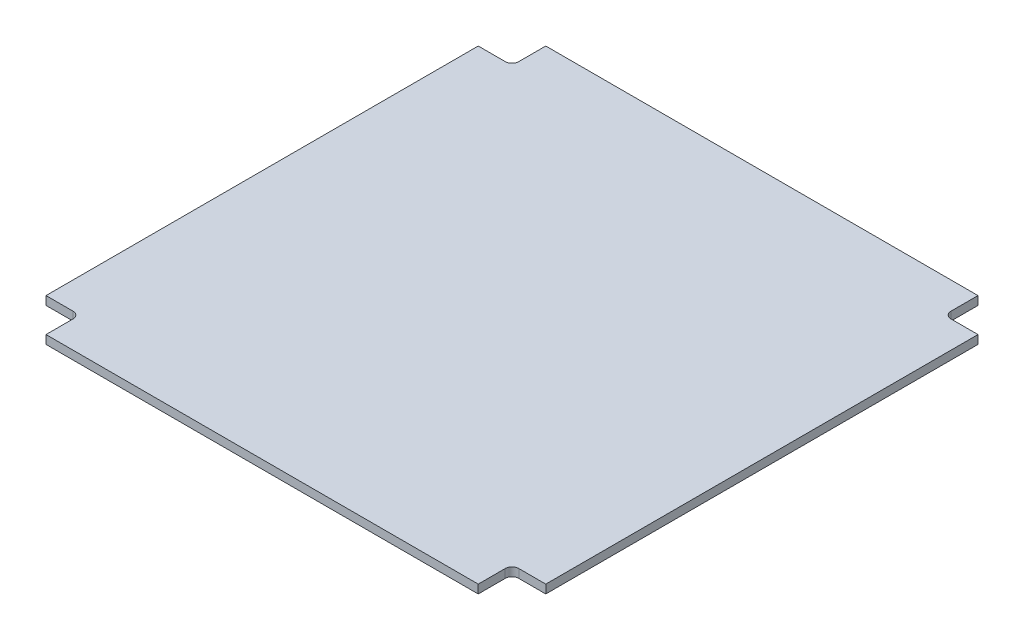
ISO-10303-21;
HEADER;
FILE_DESCRIPTION(('STEP AP214'),'2;1');
FILE_NAME('part.step','',(''),(''),'','','');
FILE_SCHEMA(('AUTOMOTIVE_DESIGN { 1 0 10303 214 1 1 1 1 }'));
ENDSEC;
DATA;
#1=APPLICATION_CONTEXT('core data for automotive mechanical design processes');
#2=APPLICATION_PROTOCOL_DEFINITION('international standard','automotive_design',2000,#1);
#3=PRODUCT_CONTEXT('',#1,'mechanical');
#4=PRODUCT('Part','Part','',(#3));
#5=PRODUCT_RELATED_PRODUCT_CATEGORY('part','',(#4));
#6=PRODUCT_DEFINITION_FORMATION('','',#4);
#7=PRODUCT_DEFINITION_CONTEXT('part definition',#1,'design');
#8=PRODUCT_DEFINITION('design','',#6,#7);
#9=PRODUCT_DEFINITION_SHAPE('','',#8);
#10=(LENGTH_UNIT() NAMED_UNIT(*) SI_UNIT(.MILLI.,.METRE.));
#11=(NAMED_UNIT(*) PLANE_ANGLE_UNIT() SI_UNIT($,.RADIAN.));
#12=(NAMED_UNIT(*) SI_UNIT($,.STERADIAN.) SOLID_ANGLE_UNIT());
#13=UNCERTAINTY_MEASURE_WITH_UNIT(LENGTH_MEASURE(1.E-05),#10,'distance_accuracy_value','');
#14=(GEOMETRIC_REPRESENTATION_CONTEXT(3) GLOBAL_UNCERTAINTY_ASSIGNED_CONTEXT((#13)) GLOBAL_UNIT_ASSIGNED_CONTEXT((#10,
#11,#12)) REPRESENTATION_CONTEXT('',''));
#15=CARTESIAN_POINT('',(0.,0.,0.));
#16=DIRECTION('',(0.,0.,1.));
#17=DIRECTION('',(1.,0.,0.));
#18=AXIS2_PLACEMENT_3D('',#15,#16,#17);
#19=CARTESIAN_POINT('',(0.,6.35,0.));
#20=DIRECTION('',(0.,1.,0.));
#21=DIRECTION('',(0.,0.,1.));
#22=AXIS2_PLACEMENT_3D('',#19,#20,#21);
#23=PLANE('',#22);
#24=DIRECTION('',(0.,0.,-1.));
#25=VECTOR('',#24,1.);
#26=CARTESIAN_POINT('',(-159.999999999999,6.35,-165.000000000001));
#27=LINE('',#26,#25);
#28=CARTESIAN_POINT('',(-159.999999999999,6.35,-165.000000000001));
#29=VERTEX_POINT('',#28);
#30=CARTESIAN_POINT('',(-159.999999999999,6.35,-185.));
#31=VERTEX_POINT('',#30);
#32=EDGE_CURVE('E259',#29,#31,#27,.T.);
#33=ORIENTED_EDGE('',*,*,#32,.F.);
#34=CARTESIAN_POINT('',(-164.999999999999,6.35,-165.000000000001));
#35=DIRECTION('',(0.,1.,0.));
#36=DIRECTION('',(0.,0.,1.));
#37=AXIS2_PLACEMENT_3D('',#34,#35,#36);
#38=CIRCLE('',#37,4.99999999999999);
#39=CARTESIAN_POINT('',(-164.999999999999,6.35,-160.000000000001));
#40=VERTEX_POINT('',#39);
#41=EDGE_CURVE('E280',#40,#29,#38,.T.);
#42=ORIENTED_EDGE('',*,*,#41,.F.);
#43=DIRECTION('',(1.,0.,0.));
#44=VECTOR('',#43,1.);
#45=CARTESIAN_POINT('',(-184.999999999999,6.35,-160.000000000001));
#46=LINE('',#45,#44);
#47=CARTESIAN_POINT('',(-184.999999999999,6.35,-160.000000000001));
#48=VERTEX_POINT('',#47);
#49=EDGE_CURVE('E437',#48,#40,#46,.T.);
#50=ORIENTED_EDGE('',*,*,#49,.F.);
#51=DIRECTION('',(0.,0.,1.));
#52=VECTOR('',#51,1.);
#53=CARTESIAN_POINT('',(-185.,6.35,-185.));
#54=LINE('',#53,#52);
#55=CARTESIAN_POINT('',(-185.,6.35,160.));
#56=VERTEX_POINT('',#55);
#57=EDGE_CURVE('E180',#48,#56,#54,.T.);
#58=ORIENTED_EDGE('',*,*,#57,.T.);
#59=DIRECTION('',(-1.,0.,0.));
#60=VECTOR('',#59,1.);
#61=CARTESIAN_POINT('',(-165.,6.35,160.));
#62=LINE('',#61,#60);
#63=CARTESIAN_POINT('',(-165.,6.35,160.));
#64=VERTEX_POINT('',#63);
#65=EDGE_CURVE('E243',#64,#56,#62,.T.);
#66=ORIENTED_EDGE('',*,*,#65,.F.);
#67=CARTESIAN_POINT('',(-165.,6.35,165.));
#68=DIRECTION('',(0.,1.,0.));
#69=DIRECTION('',(0.,0.,1.));
#70=AXIS2_PLACEMENT_3D('',#67,#68,#69);
#71=CIRCLE('',#70,4.99999999999999);
#72=CARTESIAN_POINT('',(-160.,6.35,165.));
#73=VERTEX_POINT('',#72);
#74=EDGE_CURVE('E238',#73,#64,#71,.T.);
#75=ORIENTED_EDGE('',*,*,#74,.F.);
#76=DIRECTION('',(0.,0.,-1.));
#77=VECTOR('',#76,1.);
#78=CARTESIAN_POINT('',(-160.,6.35,185.));
#79=LINE('',#78,#77);
#80=CARTESIAN_POINT('',(-160.,6.35,185.));
#81=VERTEX_POINT('',#80);
#82=EDGE_CURVE('E178',#81,#73,#79,.T.);
#83=ORIENTED_EDGE('',*,*,#82,.F.);
#84=DIRECTION('',(1.,0.,0.));
#85=VECTOR('',#84,1.);
#86=CARTESIAN_POINT('',(-185.,6.35,185.));
#87=LINE('',#86,#85);
#88=CARTESIAN_POINT('',(159.999999999998,6.35,185.));
#89=VERTEX_POINT('',#88);
#90=EDGE_CURVE('E169',#81,#89,#87,.T.);
#91=ORIENTED_EDGE('',*,*,#90,.T.);
#92=DIRECTION('',(0.,0.,1.));
#93=VECTOR('',#92,1.);
#94=CARTESIAN_POINT('',(159.999999999998,6.35,165.000000000002));
#95=LINE('',#94,#93);
#96=CARTESIAN_POINT('',(159.999999999998,6.35,165.000000000002));
#97=VERTEX_POINT('',#96);
#98=EDGE_CURVE('E150',#97,#89,#95,.T.);
#99=ORIENTED_EDGE('',*,*,#98,.F.);
#100=CARTESIAN_POINT('',(164.999999999998,6.35,165.000000000002));
#101=DIRECTION('',(0.,1.,0.));
#102=DIRECTION('',(0.,0.,1.));
#103=AXIS2_PLACEMENT_3D('',#100,#101,#102);
#104=CIRCLE('',#103,4.99999999999999);
#105=CARTESIAN_POINT('',(164.999999999998,6.35,160.000000000002));
#106=VERTEX_POINT('',#105);
#107=EDGE_CURVE('E281',#106,#97,#104,.T.);
#108=ORIENTED_EDGE('',*,*,#107,.F.);
#109=DIRECTION('',(-1.,0.,0.));
#110=VECTOR('',#109,1.);
#111=CARTESIAN_POINT('',(184.999999999998,6.35,160.000000000002));
#112=LINE('',#111,#110);
#113=CARTESIAN_POINT('',(184.999999999998,6.35,160.000000000002));
#114=VERTEX_POINT('',#113);
#115=EDGE_CURVE('E283',#114,#106,#112,.T.);
#116=ORIENTED_EDGE('',*,*,#115,.F.);
#117=DIRECTION('',(0.,0.,-1.));
#118=VECTOR('',#117,1.);
#119=CARTESIAN_POINT('',(185.,6.35,185.));
#120=LINE('',#119,#118);
#121=CARTESIAN_POINT('',(185.,6.35,-159.999999999999));
#122=VERTEX_POINT('',#121);
#123=EDGE_CURVE('E198',#114,#122,#120,.T.);
#124=ORIENTED_EDGE('',*,*,#123,.T.);
#125=DIRECTION('',(1.,0.,0.));
#126=VECTOR('',#125,1.);
#127=CARTESIAN_POINT('',(165.000000000001,6.35,-159.999999999999));
#128=LINE('',#127,#126);
#129=CARTESIAN_POINT('',(165.000000000001,6.35,-159.999999999999));
#130=VERTEX_POINT('',#129);
#131=EDGE_CURVE('E221',#130,#122,#128,.T.);
#132=ORIENTED_EDGE('',*,*,#131,.F.);
#133=CARTESIAN_POINT('',(165.000000000001,6.35,-164.999999999999));
#134=DIRECTION('',(0.,1.,0.));
#135=DIRECTION('',(0.,0.,1.));
#136=AXIS2_PLACEMENT_3D('',#133,#134,#135);
#137=CIRCLE('',#136,4.99999999999999);
#138=CARTESIAN_POINT('',(160.000000000001,6.35,-164.999999999999));
#139=VERTEX_POINT('',#138);
#140=EDGE_CURVE('E272',#139,#130,#137,.T.);
#141=ORIENTED_EDGE('',*,*,#140,.F.);
#142=DIRECTION('',(0.,0.,1.));
#143=VECTOR('',#142,1.);
#144=CARTESIAN_POINT('',(160.000000000001,6.35,-184.999999999999));
#145=LINE('',#144,#143);
#146=CARTESIAN_POINT('',(160.000000000001,6.35,-184.999999999999));
#147=VERTEX_POINT('',#146);
#148=EDGE_CURVE('E219',#147,#139,#145,.T.);
#149=ORIENTED_EDGE('',*,*,#148,.F.);
#150=DIRECTION('',(-1.,0.,0.));
#151=VECTOR('',#150,1.);
#152=CARTESIAN_POINT('',(185.,6.35,-185.));
#153=LINE('',#152,#151);
#154=EDGE_CURVE('E184',#147,#31,#153,.T.);
#155=ORIENTED_EDGE('',*,*,#154,.T.);
#156=EDGE_LOOP('',(#33,#42,#50,#58,#66,#75,#83,#91,#99,#108,#116,#124,#132,#141,#149,#155));
#157=FACE_BOUND('',#156,.T.);
#158=ADVANCED_FACE('F32',(#157),#23,.T.);
#159=CARTESIAN_POINT('',(0.,0.,0.));
#160=DIRECTION('',(0.,1.,0.));
#161=DIRECTION('',(0.,0.,1.));
#162=AXIS2_PLACEMENT_3D('',#159,#160,#161);
#163=PLANE('',#162);
#164=CARTESIAN_POINT('',(-164.999999999999,0.,-165.000000000001));
#165=DIRECTION('',(0.,-1.,0.));
#166=DIRECTION('',(0.,0.,-1.));
#167=AXIS2_PLACEMENT_3D('',#164,#165,#166);
#168=CIRCLE('',#167,4.99999999999999);
#169=CARTESIAN_POINT('',(-159.999999999999,0.,-165.000000000001));
#170=VERTEX_POINT('',#169);
#171=CARTESIAN_POINT('',(-164.999999999999,0.,-160.000000000001));
#172=VERTEX_POINT('',#171);
#173=EDGE_CURVE('E11',#170,#172,#168,.T.);
#174=ORIENTED_EDGE('',*,*,#173,.F.);
#175=DIRECTION('',(0.,0.,-1.));
#176=VECTOR('',#175,1.);
#177=CARTESIAN_POINT('',(-160.,0.,-6.66133814775094E-13));
#178=LINE('',#177,#176);
#179=CARTESIAN_POINT('',(-159.999999999999,0.,-185.000000000001));
#180=VERTEX_POINT('',#179);
#181=EDGE_CURVE('E78',#170,#180,#178,.T.);
#182=ORIENTED_EDGE('',*,*,#181,.T.);
#183=DIRECTION('',(-1.,0.,0.));
#184=VECTOR('',#183,1.);
#185=CARTESIAN_POINT('',(185.,0.,-185.));
#186=LINE('',#185,#184);
#187=CARTESIAN_POINT('',(160.000000000001,0.,-185.));
#188=VERTEX_POINT('',#187);
#189=EDGE_CURVE('E191',#188,#180,#186,.T.);
#190=ORIENTED_EDGE('',*,*,#189,.F.);
#191=DIRECTION('',(0.,0.,1.));
#192=VECTOR('',#191,1.);
#193=CARTESIAN_POINT('',(160.,0.,1.11022302462516E-12));
#194=LINE('',#193,#192);
#195=CARTESIAN_POINT('',(160.000000000001,0.,-164.999999999999));
#196=VERTEX_POINT('',#195);
#197=EDGE_CURVE('E49',#188,#196,#194,.T.);
#198=ORIENTED_EDGE('',*,*,#197,.T.);
#199=CARTESIAN_POINT('',(165.000000000001,0.,-164.999999999999));
#200=DIRECTION('',(0.,-1.,0.));
#201=DIRECTION('',(0.,0.,-1.));
#202=AXIS2_PLACEMENT_3D('',#199,#200,#201);
#203=CIRCLE('',#202,4.99999999999999);
#204=CARTESIAN_POINT('',(165.000000000001,0.,-159.999999999999));
#205=VERTEX_POINT('',#204);
#206=EDGE_CURVE('E41',#205,#196,#203,.T.);
#207=ORIENTED_EDGE('',*,*,#206,.F.);
#208=DIRECTION('',(1.,0.,0.));
#209=VECTOR('',#208,1.);
#210=CARTESIAN_POINT('',(1.33226762955019E-12,0.,-160.));
#211=LINE('',#210,#209);
#212=CARTESIAN_POINT('',(185.000000000001,0.,-159.999999999999));
#213=VERTEX_POINT('',#212);
#214=EDGE_CURVE('E236',#205,#213,#211,.T.);
#215=ORIENTED_EDGE('',*,*,#214,.T.);
#216=DIRECTION('',(0.,0.,-1.));
#217=VECTOR('',#216,1.);
#218=CARTESIAN_POINT('',(185.,0.,185.));
#219=LINE('',#218,#217);
#220=CARTESIAN_POINT('',(184.999999999998,0.,160.000000000002));
#221=VERTEX_POINT('',#220);
#222=EDGE_CURVE('E188',#221,#213,#219,.T.);
#223=ORIENTED_EDGE('',*,*,#222,.F.);
#224=DIRECTION('',(-1.,0.,0.));
#225=VECTOR('',#224,1.);
#226=CARTESIAN_POINT('',(-1.77635683940025E-12,0.,160.));
#227=LINE('',#226,#225);
#228=CARTESIAN_POINT('',(164.999999999998,0.,160.000000000002));
#229=VERTEX_POINT('',#228);
#230=EDGE_CURVE('E227',#221,#229,#227,.T.);
#231=ORIENTED_EDGE('',*,*,#230,.T.);
#232=CARTESIAN_POINT('',(164.999999999998,0.,165.000000000002));
#233=DIRECTION('',(0.,-1.,0.));
#234=DIRECTION('',(0.,0.,-1.));
#235=AXIS2_PLACEMENT_3D('',#232,#233,#234);
#236=CIRCLE('',#235,4.99999999999999);
#237=CARTESIAN_POINT('',(159.999999999998,0.,165.000000000002));
#238=VERTEX_POINT('',#237);
#239=EDGE_CURVE('E206',#238,#229,#236,.T.);
#240=ORIENTED_EDGE('',*,*,#239,.F.);
#241=DIRECTION('',(0.,0.,1.));
#242=VECTOR('',#241,1.);
#243=CARTESIAN_POINT('',(160.,0.,1.99840144432528E-12));
#244=LINE('',#243,#242);
#245=CARTESIAN_POINT('',(159.999999999998,0.,185.000000000002));
#246=VERTEX_POINT('',#245);
#247=EDGE_CURVE('E230',#238,#246,#244,.T.);
#248=ORIENTED_EDGE('',*,*,#247,.T.);
#249=DIRECTION('',(1.,0.,0.));
#250=VECTOR('',#249,1.);
#251=CARTESIAN_POINT('',(-185.,0.,185.));
#252=LINE('',#251,#250);
#253=CARTESIAN_POINT('',(-160.,0.,185.));
#254=VERTEX_POINT('',#253);
#255=EDGE_CURVE('E171',#254,#246,#252,.T.);
#256=ORIENTED_EDGE('',*,*,#255,.F.);
#257=DIRECTION('',(0.,0.,-1.));
#258=VECTOR('',#257,1.);
#259=CARTESIAN_POINT('',(-160.,0.,0.));
#260=LINE('',#259,#258);
#261=CARTESIAN_POINT('',(-160.,0.,165.));
#262=VERTEX_POINT('',#261);
#263=EDGE_CURVE('E182',#254,#262,#260,.T.);
#264=ORIENTED_EDGE('',*,*,#263,.T.);
#265=CARTESIAN_POINT('',(-165.,0.,165.));
#266=DIRECTION('',(0.,-1.,0.));
#267=DIRECTION('',(0.,0.,-1.));
#268=AXIS2_PLACEMENT_3D('',#265,#266,#267);
#269=CIRCLE('',#268,4.99999999999999);
#270=CARTESIAN_POINT('',(-165.,0.,160.));
#271=VERTEX_POINT('',#270);
#272=EDGE_CURVE('E179',#271,#262,#269,.T.);
#273=ORIENTED_EDGE('',*,*,#272,.F.);
#274=DIRECTION('',(-1.,0.,0.));
#275=VECTOR('',#274,1.);
#276=CARTESIAN_POINT('',(-2.22044604925031E-13,0.,160.));
#277=LINE('',#276,#275);
#278=CARTESIAN_POINT('',(-185.,0.,160.));
#279=VERTEX_POINT('',#278);
#280=EDGE_CURVE('E172',#271,#279,#277,.T.);
#281=ORIENTED_EDGE('',*,*,#280,.T.);
#282=DIRECTION('',(0.,0.,1.));
#283=VECTOR('',#282,1.);
#284=CARTESIAN_POINT('',(-185.,0.,-185.));
#285=LINE('',#284,#283);
#286=CARTESIAN_POINT('',(-185.,0.,-160.000000000001));
#287=VERTEX_POINT('',#286);
#288=EDGE_CURVE('E195',#287,#279,#285,.T.);
#289=ORIENTED_EDGE('',*,*,#288,.F.);
#290=DIRECTION('',(1.,0.,0.));
#291=VECTOR('',#290,1.);
#292=CARTESIAN_POINT('',(4.44089209850063E-13,0.,-160.));
#293=LINE('',#292,#291);
#294=EDGE_CURVE('E225',#287,#172,#293,.T.);
#295=ORIENTED_EDGE('',*,*,#294,.T.);
#296=EDGE_LOOP('',(#174,#182,#190,#198,#207,#215,#223,#231,#240,#248,#256,#264,#273,#281,#289,#295));
#297=FACE_BOUND('',#296,.T.);
#298=ADVANCED_FACE('F224',(#297),#163,.F.);
#299=CARTESIAN_POINT('',(185.,6.35,185.));
#300=DIRECTION('',(-1.,0.,0.));
#301=DIRECTION('',(0.,0.,1.));
#302=AXIS2_PLACEMENT_3D('',#299,#300,#301);
#303=PLANE('',#302);
#304=ORIENTED_EDGE('',*,*,#222,.T.);
#305=DIRECTION('',(0.,1.,0.));
#306=VECTOR('',#305,1.);
#307=CARTESIAN_POINT('',(185.000000000001,-1.2E-05,-159.999999999999));
#308=LINE('',#307,#306);
#309=EDGE_CURVE('E275',#213,#122,#308,.T.);
#310=ORIENTED_EDGE('',*,*,#309,.T.);
#311=ORIENTED_EDGE('',*,*,#123,.F.);
#312=DIRECTION('',(0.,1.,0.));
#313=VECTOR('',#312,1.);
#314=CARTESIAN_POINT('',(184.999999999998,-1.2E-05,160.000000000002));
#315=LINE('',#314,#313);
#316=EDGE_CURVE('E161',#221,#114,#315,.T.);
#317=ORIENTED_EDGE('',*,*,#316,.F.);
#318=EDGE_LOOP('',(#304,#310,#311,#317));
#319=FACE_BOUND('',#318,.T.);
#320=ADVANCED_FACE('F34',(#319),#303,.F.);
#321=CARTESIAN_POINT('',(185.,6.35,-185.));
#322=DIRECTION('',(0.,0.,1.));
#323=DIRECTION('',(1.,0.,0.));
#324=AXIS2_PLACEMENT_3D('',#321,#322,#323);
#325=PLANE('',#324);
#326=ORIENTED_EDGE('',*,*,#189,.T.);
#327=DIRECTION('',(0.,1.,0.));
#328=VECTOR('',#327,1.);
#329=CARTESIAN_POINT('',(-159.999999999999,-1.2E-05,-185.000000000001));
#330=LINE('',#329,#328);
#331=EDGE_CURVE('E264',#180,#31,#330,.T.);
#332=ORIENTED_EDGE('',*,*,#331,.T.);
#333=ORIENTED_EDGE('',*,*,#154,.F.);
#334=DIRECTION('',(0.,-1.,0.));
#335=VECTOR('',#334,1.);
#336=CARTESIAN_POINT('',(160.000000000001,6.35,-185.));
#337=LINE('',#336,#335);
#338=EDGE_CURVE('E204',#147,#188,#337,.T.);
#339=ORIENTED_EDGE('',*,*,#338,.T.);
#340=EDGE_LOOP('',(#326,#332,#333,#339));
#341=FACE_BOUND('',#340,.T.);
#342=ADVANCED_FACE('F263',(#341),#325,.F.);
#343=CARTESIAN_POINT('',(-185.,6.35,-185.));
#344=DIRECTION('',(1.,0.,0.));
#345=DIRECTION('',(0.,0.,-1.));
#346=AXIS2_PLACEMENT_3D('',#343,#344,#345);
#347=PLANE('',#346);
#348=ORIENTED_EDGE('',*,*,#57,.F.);
#349=DIRECTION('',(0.,-1.,0.));
#350=VECTOR('',#349,1.);
#351=CARTESIAN_POINT('',(-185.,6.35,-160.000000000001));
#352=LINE('',#351,#350);
#353=EDGE_CURVE('E94',#48,#287,#352,.T.);
#354=ORIENTED_EDGE('',*,*,#353,.T.);
#355=ORIENTED_EDGE('',*,*,#288,.T.);
#356=DIRECTION('',(0.,1.,0.));
#357=VECTOR('',#356,1.);
#358=CARTESIAN_POINT('',(-185.,-1.2E-05,160.));
#359=LINE('',#358,#357);
#360=EDGE_CURVE('E192',#279,#56,#359,.T.);
#361=ORIENTED_EDGE('',*,*,#360,.T.);
#362=EDGE_LOOP('',(#348,#354,#355,#361));
#363=FACE_BOUND('',#362,.T.);
#364=ADVANCED_FACE('F327',(#363),#347,.F.);
#365=CARTESIAN_POINT('',(-185.,6.35,185.));
#366=DIRECTION('',(0.,0.,-1.));
#367=DIRECTION('',(-1.,0.,0.));
#368=AXIS2_PLACEMENT_3D('',#365,#366,#367);
#369=PLANE('',#368);
#370=ORIENTED_EDGE('',*,*,#255,.T.);
#371=DIRECTION('',(0.,1.,0.));
#372=VECTOR('',#371,1.);
#373=CARTESIAN_POINT('',(159.999999999998,6.35,185.));
#374=LINE('',#373,#372);
#375=EDGE_CURVE('E153',#246,#89,#374,.T.);
#376=ORIENTED_EDGE('',*,*,#375,.T.);
#377=ORIENTED_EDGE('',*,*,#90,.F.);
#378=DIRECTION('',(0.,1.,0.));
#379=VECTOR('',#378,1.);
#380=CARTESIAN_POINT('',(-160.,-1.2E-05,185.));
#381=LINE('',#380,#379);
#382=EDGE_CURVE('E246',#254,#81,#381,.T.);
#383=ORIENTED_EDGE('',*,*,#382,.F.);
#384=EDGE_LOOP('',(#370,#376,#377,#383));
#385=FACE_BOUND('',#384,.T.);
#386=ADVANCED_FACE('F167',(#385),#369,.F.);
#387=CARTESIAN_POINT('',(-165.,-1.2E-05,160.));
#388=DIRECTION('',(0.,0.,-1.));
#389=DIRECTION('',(-1.,0.,0.));
#390=AXIS2_PLACEMENT_3D('',#387,#388,#389);
#391=PLANE('',#390);
#392=DIRECTION('',(0.,-1.,0.));
#393=VECTOR('',#392,1.);
#394=CARTESIAN_POINT('',(-165.,6.351,160.));
#395=LINE('',#394,#393);
#396=EDGE_CURVE('E242',#64,#271,#395,.T.);
#397=ORIENTED_EDGE('',*,*,#396,.F.);
#398=ORIENTED_EDGE('',*,*,#65,.T.);
#399=ORIENTED_EDGE('',*,*,#360,.F.);
#400=ORIENTED_EDGE('',*,*,#280,.F.);
#401=EDGE_LOOP('',(#397,#398,#399,#400));
#402=FACE_BOUND('',#401,.T.);
#403=ADVANCED_FACE('F326',(#402),#391,.F.);
#404=CARTESIAN_POINT('',(-160.,-1.2E-05,185.));
#405=DIRECTION('',(1.,0.,0.));
#406=DIRECTION('',(0.,0.,-1.));
#407=AXIS2_PLACEMENT_3D('',#404,#405,#406);
#408=PLANE('',#407);
#409=ORIENTED_EDGE('',*,*,#382,.T.);
#410=ORIENTED_EDGE('',*,*,#82,.T.);
#411=DIRECTION('',(0.,-1.,0.));
#412=VECTOR('',#411,1.);
#413=CARTESIAN_POINT('',(-160.,6.351,165.));
#414=LINE('',#413,#412);
#415=EDGE_CURVE('E247',#73,#262,#414,.T.);
#416=ORIENTED_EDGE('',*,*,#415,.T.);
#417=ORIENTED_EDGE('',*,*,#263,.F.);
#418=EDGE_LOOP('',(#409,#410,#416,#417));
#419=FACE_BOUND('',#418,.T.);
#420=ADVANCED_FACE('F310',(#419),#408,.F.);
#421=CARTESIAN_POINT('',(-165.,6.351,165.));
#422=DIRECTION('',(0.,-1.,0.));
#423=DIRECTION('',(0.,0.,-1.));
#424=AXIS2_PLACEMENT_3D('',#421,#422,#423);
#425=CYLINDRICAL_SURFACE('',#424,4.99999999999999);
#426=ORIENTED_EDGE('',*,*,#272,.T.);
#427=ORIENTED_EDGE('',*,*,#415,.F.);
#428=ORIENTED_EDGE('',*,*,#74,.T.);
#429=ORIENTED_EDGE('',*,*,#396,.T.);
#430=EDGE_LOOP('',(#426,#427,#428,#429));
#431=FACE_BOUND('',#430,.T.);
#432=ADVANCED_FACE('F303',(#431),#425,.F.);
#433=CARTESIAN_POINT('',(164.999999999998,6.351,165.000000000002));
#434=DIRECTION('',(0.,-1.,0.));
#435=DIRECTION('',(0.,0.,-1.));
#436=AXIS2_PLACEMENT_3D('',#433,#434,#435);
#437=CYLINDRICAL_SURFACE('',#436,4.99999999999999);
#438=ORIENTED_EDGE('',*,*,#239,.T.);
#439=DIRECTION('',(0.,-1.,0.));
#440=VECTOR('',#439,1.);
#441=CARTESIAN_POINT('',(164.999999999998,6.351,160.000000000002));
#442=LINE('',#441,#440);
#443=EDGE_CURVE('E162',#106,#229,#442,.T.);
#444=ORIENTED_EDGE('',*,*,#443,.F.);
#445=ORIENTED_EDGE('',*,*,#107,.T.);
#446=DIRECTION('',(0.,-1.,0.));
#447=VECTOR('',#446,1.);
#448=CARTESIAN_POINT('',(159.999999999998,6.351,165.000000000002));
#449=LINE('',#448,#447);
#450=EDGE_CURVE('E156',#97,#238,#449,.T.);
#451=ORIENTED_EDGE('',*,*,#450,.T.);
#452=EDGE_LOOP('',(#438,#444,#445,#451));
#453=FACE_BOUND('',#452,.T.);
#454=ADVANCED_FACE('F301',(#453),#437,.F.);
#455=CARTESIAN_POINT('',(184.999999999998,-1.2E-05,160.000000000002));
#456=DIRECTION('',(0.,0.,-1.));
#457=DIRECTION('',(-1.,0.,0.));
#458=AXIS2_PLACEMENT_3D('',#455,#456,#457);
#459=PLANE('',#458);
#460=ORIENTED_EDGE('',*,*,#316,.T.);
#461=ORIENTED_EDGE('',*,*,#115,.T.);
#462=ORIENTED_EDGE('',*,*,#443,.T.);
#463=ORIENTED_EDGE('',*,*,#230,.F.);
#464=EDGE_LOOP('',(#460,#461,#462,#463));
#465=FACE_BOUND('',#464,.T.);
#466=ADVANCED_FACE('F292',(#465),#459,.F.);
#467=CARTESIAN_POINT('',(159.999999999998,-1.2E-05,165.000000000002));
#468=DIRECTION('',(-1.,0.,0.));
#469=DIRECTION('',(0.,0.,1.));
#470=AXIS2_PLACEMENT_3D('',#467,#468,#469);
#471=PLANE('',#470);
#472=ORIENTED_EDGE('',*,*,#450,.F.);
#473=ORIENTED_EDGE('',*,*,#98,.T.);
#474=ORIENTED_EDGE('',*,*,#375,.F.);
#475=ORIENTED_EDGE('',*,*,#247,.F.);
#476=EDGE_LOOP('',(#472,#473,#474,#475));
#477=FACE_BOUND('',#476,.T.);
#478=ADVANCED_FACE('F152',(#477),#471,.F.);
#479=CARTESIAN_POINT('',(-164.999999999999,6.351,-165.000000000001));
#480=DIRECTION('',(0.,-1.,0.));
#481=DIRECTION('',(0.,0.,-1.));
#482=AXIS2_PLACEMENT_3D('',#479,#480,#481);
#483=CYLINDRICAL_SURFACE('',#482,4.99999999999999);
#484=ORIENTED_EDGE('',*,*,#173,.T.);
#485=DIRECTION('',(0.,-1.,0.));
#486=VECTOR('',#485,1.);
#487=CARTESIAN_POINT('',(-164.999999999999,6.351,-160.000000000001));
#488=LINE('',#487,#486);
#489=EDGE_CURVE('E266',#40,#172,#488,.T.);
#490=ORIENTED_EDGE('',*,*,#489,.F.);
#491=ORIENTED_EDGE('',*,*,#41,.T.);
#492=DIRECTION('',(0.,-1.,0.));
#493=VECTOR('',#492,1.);
#494=CARTESIAN_POINT('',(-159.999999999999,6.351,-165.000000000001));
#495=LINE('',#494,#493);
#496=EDGE_CURVE('E270',#29,#170,#495,.T.);
#497=ORIENTED_EDGE('',*,*,#496,.T.);
#498=EDGE_LOOP('',(#484,#490,#491,#497));
#499=FACE_BOUND('',#498,.T.);
#500=ADVANCED_FACE('F384',(#499),#483,.F.);
#501=CARTESIAN_POINT('',(-159.999999999999,-1.2E-05,-165.000000000001));
#502=DIRECTION('',(1.,0.,0.));
#503=DIRECTION('',(0.,0.,-1.));
#504=AXIS2_PLACEMENT_3D('',#501,#502,#503);
#505=PLANE('',#504);
#506=ORIENTED_EDGE('',*,*,#496,.F.);
#507=ORIENTED_EDGE('',*,*,#32,.T.);
#508=ORIENTED_EDGE('',*,*,#331,.F.);
#509=ORIENTED_EDGE('',*,*,#181,.F.);
#510=EDGE_LOOP('',(#506,#507,#508,#509));
#511=FACE_BOUND('',#510,.T.);
#512=ADVANCED_FACE('F391',(#511),#505,.F.);
#513=CARTESIAN_POINT('',(-184.999999999999,-1.2E-05,-160.000000000001));
#514=DIRECTION('',(0.,0.,1.));
#515=DIRECTION('',(1.,0.,0.));
#516=AXIS2_PLACEMENT_3D('',#513,#514,#515);
#517=PLANE('',#516);
#518=ORIENTED_EDGE('',*,*,#353,.F.);
#519=ORIENTED_EDGE('',*,*,#49,.T.);
#520=ORIENTED_EDGE('',*,*,#489,.T.);
#521=ORIENTED_EDGE('',*,*,#294,.F.);
#522=EDGE_LOOP('',(#518,#519,#520,#521));
#523=FACE_BOUND('',#522,.T.);
#524=ADVANCED_FACE('F399',(#523),#517,.F.);
#525=CARTESIAN_POINT('',(165.000000000001,6.351,-164.999999999999));
#526=DIRECTION('',(0.,-1.,0.));
#527=DIRECTION('',(0.,0.,-1.));
#528=AXIS2_PLACEMENT_3D('',#525,#526,#527);
#529=CYLINDRICAL_SURFACE('',#528,4.99999999999999);
#530=ORIENTED_EDGE('',*,*,#206,.T.);
#531=DIRECTION('',(0.,-1.,0.));
#532=VECTOR('',#531,1.);
#533=CARTESIAN_POINT('',(160.000000000001,6.351,-164.999999999999));
#534=LINE('',#533,#532);
#535=EDGE_CURVE('E212',#139,#196,#534,.T.);
#536=ORIENTED_EDGE('',*,*,#535,.F.);
#537=ORIENTED_EDGE('',*,*,#140,.T.);
#538=DIRECTION('',(0.,-1.,0.));
#539=VECTOR('',#538,1.);
#540=CARTESIAN_POINT('',(165.000000000001,6.351,-159.999999999999));
#541=LINE('',#540,#539);
#542=EDGE_CURVE('E214',#130,#205,#541,.T.);
#543=ORIENTED_EDGE('',*,*,#542,.T.);
#544=EDGE_LOOP('',(#530,#536,#537,#543));
#545=FACE_BOUND('',#544,.T.);
#546=ADVANCED_FACE('F210',(#545),#529,.F.);
#547=CARTESIAN_POINT('',(165.000000000001,-1.2E-05,-159.999999999999));
#548=DIRECTION('',(0.,0.,1.));
#549=DIRECTION('',(1.,0.,0.));
#550=AXIS2_PLACEMENT_3D('',#547,#548,#549);
#551=PLANE('',#550);
#552=ORIENTED_EDGE('',*,*,#542,.F.);
#553=ORIENTED_EDGE('',*,*,#131,.T.);
#554=ORIENTED_EDGE('',*,*,#309,.F.);
#555=ORIENTED_EDGE('',*,*,#214,.F.);
#556=EDGE_LOOP('',(#552,#553,#554,#555));
#557=FACE_BOUND('',#556,.T.);
#558=ADVANCED_FACE('F298',(#557),#551,.F.);
#559=CARTESIAN_POINT('',(160.000000000001,-1.2E-05,-184.999999999999));
#560=DIRECTION('',(-1.,0.,0.));
#561=DIRECTION('',(0.,0.,1.));
#562=AXIS2_PLACEMENT_3D('',#559,#560,#561);
#563=PLANE('',#562);
#564=ORIENTED_EDGE('',*,*,#338,.F.);
#565=ORIENTED_EDGE('',*,*,#148,.T.);
#566=ORIENTED_EDGE('',*,*,#535,.T.);
#567=ORIENTED_EDGE('',*,*,#197,.F.);
#568=EDGE_LOOP('',(#564,#565,#566,#567));
#569=FACE_BOUND('',#568,.T.);
#570=ADVANCED_FACE('F217',(#569),#563,.F.);
#571=CLOSED_SHELL('',(#158,#298,#320,#342,#364,#386,#403,#420,#432,#454,#466,#478,#500,#512,
#524,#546,#558,#570));
#572=MANIFOLD_SOLID_BREP('B2',#571);
#573=ADVANCED_BREP_SHAPE_REPRESENTATION('',(#18,#572),#14);
#574=SHAPE_DEFINITION_REPRESENTATION(#9,#573);
ENDSEC;
END-ISO-10303-21;
